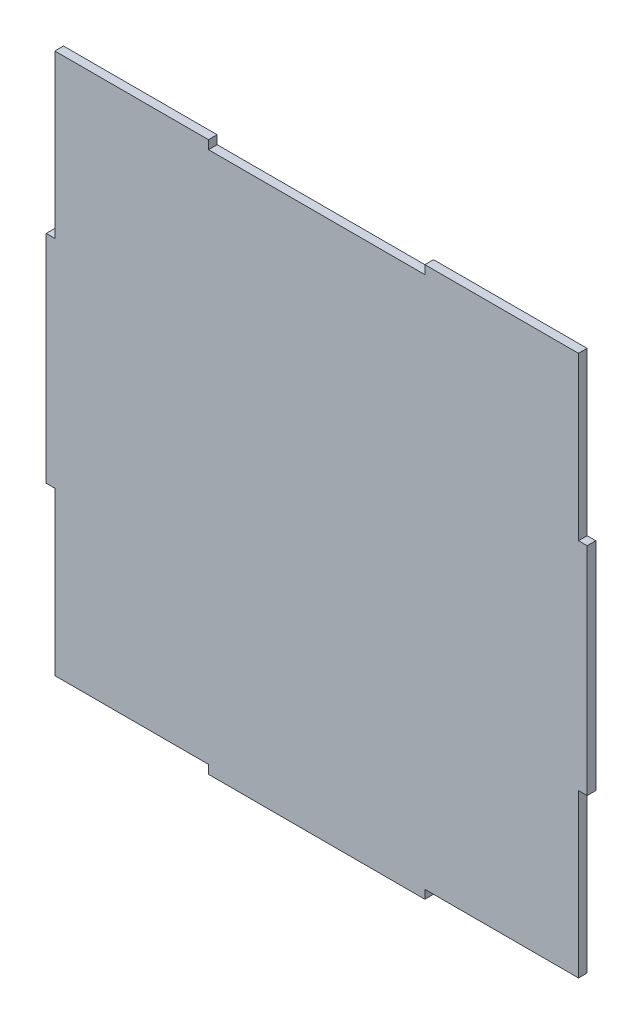
ISO-10303-21;
HEADER;
FILE_DESCRIPTION(('STEP AP214'),'2;1');
FILE_NAME('part.step','',(''),(''),'','','');
FILE_SCHEMA(('AUTOMOTIVE_DESIGN { 1 0 10303 214 1 1 1 1 }'));
ENDSEC;
DATA;
#1=APPLICATION_CONTEXT('core data for automotive mechanical design processes');
#2=APPLICATION_PROTOCOL_DEFINITION('international standard','automotive_design',2000,#1);
#3=PRODUCT_CONTEXT('',#1,'mechanical');
#4=PRODUCT('Part','Part','',(#3));
#5=PRODUCT_RELATED_PRODUCT_CATEGORY('part','',(#4));
#6=PRODUCT_DEFINITION_FORMATION('','',#4);
#7=PRODUCT_DEFINITION_CONTEXT('part definition',#1,'design');
#8=PRODUCT_DEFINITION('design','',#6,#7);
#9=PRODUCT_DEFINITION_SHAPE('','',#8);
#10=(LENGTH_UNIT() NAMED_UNIT(*) SI_UNIT(.MILLI.,.METRE.));
#11=(NAMED_UNIT(*) PLANE_ANGLE_UNIT() SI_UNIT($,.RADIAN.));
#12=(NAMED_UNIT(*) SI_UNIT($,.STERADIAN.) SOLID_ANGLE_UNIT());
#13=UNCERTAINTY_MEASURE_WITH_UNIT(LENGTH_MEASURE(1.E-05),#10,'distance_accuracy_value','');
#14=(GEOMETRIC_REPRESENTATION_CONTEXT(3) GLOBAL_UNCERTAINTY_ASSIGNED_CONTEXT((#13)) GLOBAL_UNIT_ASSIGNED_CONTEXT((#10,
#11,#12)) REPRESENTATION_CONTEXT('',''));
#15=CARTESIAN_POINT('',(0.,0.,0.));
#16=DIRECTION('',(0.,0.,1.));
#17=DIRECTION('',(1.,0.,0.));
#18=AXIS2_PLACEMENT_3D('',#15,#16,#17);
#19=CARTESIAN_POINT('',(-49.6369586243733,1.54619828046665,4.));
#20=DIRECTION('',(0.,1.,0.));
#21=DIRECTION('',(0.,0.,1.));
#22=AXIS2_PLACEMENT_3D('',#19,#20,#21);
#23=PLANE('',#22);
#24=DIRECTION('',(1.,0.,0.));
#25=VECTOR('',#24,1.);
#26=CARTESIAN_POINT('',(-49.6369586243733,1.54619828046665,0.));
#27=LINE('',#26,#25);
#28=CARTESIAN_POINT('',(-120.636958624373,1.54619828046665,0.));
#29=VERTEX_POINT('',#28);
#30=CARTESIAN_POINT('',(-49.6369586243733,1.54619828046665,0.));
#31=VERTEX_POINT('',#30);
#32=EDGE_CURVE('E222',#29,#31,#27,.T.);
#33=ORIENTED_EDGE('',*,*,#32,.T.);
#34=DIRECTION('',(0.,0.,-1.));
#35=VECTOR('',#34,1.);
#36=CARTESIAN_POINT('',(-49.6369586243733,1.54619828046665,4.));
#37=LINE('',#36,#35);
#38=CARTESIAN_POINT('',(-49.6369586243733,1.54619828046665,4.));
#39=VERTEX_POINT('',#38);
#40=EDGE_CURVE('E11',#39,#31,#37,.T.);
#41=ORIENTED_EDGE('',*,*,#40,.F.);
#42=DIRECTION('',(1.,0.,0.));
#43=VECTOR('',#42,1.);
#44=CARTESIAN_POINT('',(-49.6369586243733,1.54619828046665,4.));
#45=LINE('',#44,#43);
#46=CARTESIAN_POINT('',(-120.636958624373,1.54619828046665,4.));
#47=VERTEX_POINT('',#46);
#48=EDGE_CURVE('E280',#47,#39,#45,.T.);
#49=ORIENTED_EDGE('',*,*,#48,.F.);
#50=DIRECTION('',(0.,0.,-1.));
#51=VECTOR('',#50,1.);
#52=CARTESIAN_POINT('',(-120.636958624373,1.54619828046665,4.));
#53=LINE('',#52,#51);
#54=EDGE_CURVE('E218',#47,#29,#53,.T.);
#55=ORIENTED_EDGE('',*,*,#54,.T.);
#56=EDGE_LOOP('',(#33,#41,#49,#55));
#57=FACE_BOUND('',#56,.T.);
#58=ADVANCED_FACE('F49',(#57),#23,.F.);
#59=CARTESIAN_POINT('',(-49.6369586243733,1.54619828046665,4.));
#60=DIRECTION('',(1.,0.,0.));
#61=DIRECTION('',(0.,0.,-1.));
#62=AXIS2_PLACEMENT_3D('',#59,#60,#61);
#63=PLANE('',#62);
#64=DIRECTION('',(0.,-1.,0.));
#65=VECTOR('',#64,1.);
#66=CARTESIAN_POINT('',(-49.6369586243733,1.54619828046665,0.));
#67=LINE('',#66,#65);
#68=CARTESIAN_POINT('',(-49.6369586243733,-2.45380171953336,0.));
#69=VERTEX_POINT('',#68);
#70=EDGE_CURVE('E226',#31,#69,#67,.T.);
#71=ORIENTED_EDGE('',*,*,#70,.T.);
#72=DIRECTION('',(0.,0.,-1.));
#73=VECTOR('',#72,1.);
#74=CARTESIAN_POINT('',(-49.6369586243733,-2.45380171953336,4.));
#75=LINE('',#74,#73);
#76=CARTESIAN_POINT('',(-49.6369586243733,-2.45380171953336,4.));
#77=VERTEX_POINT('',#76);
#78=EDGE_CURVE('E58',#77,#69,#75,.T.);
#79=ORIENTED_EDGE('',*,*,#78,.F.);
#80=DIRECTION('',(0.,-1.,0.));
#81=VECTOR('',#80,1.);
#82=CARTESIAN_POINT('',(-49.6369586243733,1.54619828046665,4.));
#83=LINE('',#82,#81);
#84=EDGE_CURVE('E145',#39,#77,#83,.T.);
#85=ORIENTED_EDGE('',*,*,#84,.F.);
#86=ORIENTED_EDGE('',*,*,#40,.T.);
#87=EDGE_LOOP('',(#71,#79,#85,#86));
#88=FACE_BOUND('',#87,.T.);
#89=ADVANCED_FACE('F430',(#88),#63,.F.);
#90=CARTESIAN_POINT('',(-49.6369586243733,-2.45380171953336,4.));
#91=DIRECTION('',(0.,1.,0.));
#92=DIRECTION('',(0.,0.,1.));
#93=AXIS2_PLACEMENT_3D('',#90,#91,#92);
#94=PLANE('',#93);
#95=DIRECTION('',(1.,0.,0.));
#96=VECTOR('',#95,1.);
#97=CARTESIAN_POINT('',(-49.6369586243733,-2.45380171953336,0.));
#98=LINE('',#97,#96);
#99=CARTESIAN_POINT('',(50.3630413756267,-2.45380171953336,0.));
#100=VERTEX_POINT('',#99);
#101=EDGE_CURVE('E229',#69,#100,#98,.T.);
#102=ORIENTED_EDGE('',*,*,#101,.T.);
#103=DIRECTION('',(0.,0.,-1.));
#104=VECTOR('',#103,1.);
#105=CARTESIAN_POINT('',(50.3630413756267,-2.45380171953336,4.));
#106=LINE('',#105,#104);
#107=CARTESIAN_POINT('',(50.3630413756267,-2.45380171953336,4.));
#108=VERTEX_POINT('',#107);
#109=EDGE_CURVE('E339',#108,#100,#106,.T.);
#110=ORIENTED_EDGE('',*,*,#109,.F.);
#111=DIRECTION('',(1.,0.,0.));
#112=VECTOR('',#111,1.);
#113=CARTESIAN_POINT('',(-49.6369586243733,-2.45380171953336,4.));
#114=LINE('',#113,#112);
#115=EDGE_CURVE('E349',#77,#108,#114,.T.);
#116=ORIENTED_EDGE('',*,*,#115,.F.);
#117=ORIENTED_EDGE('',*,*,#78,.T.);
#118=EDGE_LOOP('',(#102,#110,#116,#117));
#119=FACE_BOUND('',#118,.T.);
#120=ADVANCED_FACE('F347',(#119),#94,.F.);
#121=CARTESIAN_POINT('',(50.3630413756267,-2.45380171953336,4.));
#122=DIRECTION('',(-1.,0.,0.));
#123=DIRECTION('',(0.,0.,1.));
#124=AXIS2_PLACEMENT_3D('',#121,#122,#123);
#125=PLANE('',#124);
#126=DIRECTION('',(0.,1.,0.));
#127=VECTOR('',#126,1.);
#128=CARTESIAN_POINT('',(50.3630413756267,-2.45380171953336,0.));
#129=LINE('',#128,#127);
#130=CARTESIAN_POINT('',(50.3630413756267,1.54619828046665,0.));
#131=VERTEX_POINT('',#130);
#132=EDGE_CURVE('E232',#100,#131,#129,.T.);
#133=ORIENTED_EDGE('',*,*,#132,.T.);
#134=DIRECTION('',(0.,0.,-1.));
#135=VECTOR('',#134,1.);
#136=CARTESIAN_POINT('',(50.3630413756267,1.54619828046665,4.));
#137=LINE('',#136,#135);
#138=CARTESIAN_POINT('',(50.3630413756267,1.54619828046665,4.));
#139=VERTEX_POINT('',#138);
#140=EDGE_CURVE('E335',#139,#131,#137,.T.);
#141=ORIENTED_EDGE('',*,*,#140,.F.);
#142=DIRECTION('',(0.,1.,0.));
#143=VECTOR('',#142,1.);
#144=CARTESIAN_POINT('',(50.3630413756267,-2.45380171953336,4.));
#145=LINE('',#144,#143);
#146=EDGE_CURVE('E368',#108,#139,#145,.T.);
#147=ORIENTED_EDGE('',*,*,#146,.F.);
#148=ORIENTED_EDGE('',*,*,#109,.T.);
#149=EDGE_LOOP('',(#133,#141,#147,#148));
#150=FACE_BOUND('',#149,.T.);
#151=ADVANCED_FACE('F358',(#150),#125,.F.);
#152=CARTESIAN_POINT('',(121.363041375627,1.54619828046665,4.));
#153=DIRECTION('',(0.,1.,0.));
#154=DIRECTION('',(0.,0.,1.));
#155=AXIS2_PLACEMENT_3D('',#152,#153,#154);
#156=PLANE('',#155);
#157=DIRECTION('',(1.,0.,0.));
#158=VECTOR('',#157,1.);
#159=CARTESIAN_POINT('',(121.363041375627,1.54619828046665,0.));
#160=LINE('',#159,#158);
#161=CARTESIAN_POINT('',(121.363041375627,1.54619828046665,0.));
#162=VERTEX_POINT('',#161);
#163=EDGE_CURVE('E235',#131,#162,#160,.T.);
#164=ORIENTED_EDGE('',*,*,#163,.T.);
#165=DIRECTION('',(0.,0.,-1.));
#166=VECTOR('',#165,1.);
#167=CARTESIAN_POINT('',(121.363041375627,1.54619828046665,4.));
#168=LINE('',#167,#166);
#169=CARTESIAN_POINT('',(121.363041375627,1.54619828046665,4.));
#170=VERTEX_POINT('',#169);
#171=EDGE_CURVE('E331',#170,#162,#168,.T.);
#172=ORIENTED_EDGE('',*,*,#171,.F.);
#173=DIRECTION('',(1.,0.,0.));
#174=VECTOR('',#173,1.);
#175=CARTESIAN_POINT('',(121.363041375627,1.54619828046665,4.));
#176=LINE('',#175,#174);
#177=EDGE_CURVE('E364',#139,#170,#176,.T.);
#178=ORIENTED_EDGE('',*,*,#177,.F.);
#179=ORIENTED_EDGE('',*,*,#140,.T.);
#180=EDGE_LOOP('',(#164,#172,#178,#179));
#181=FACE_BOUND('',#180,.T.);
#182=ADVANCED_FACE('F362',(#181),#156,.F.);
#183=CARTESIAN_POINT('',(121.363041375627,76.5461982804666,4.));
#184=DIRECTION('',(-1.,0.,0.));
#185=DIRECTION('',(0.,0.,1.));
#186=AXIS2_PLACEMENT_3D('',#183,#184,#185);
#187=PLANE('',#186);
#188=DIRECTION('',(0.,1.,0.));
#189=VECTOR('',#188,1.);
#190=CARTESIAN_POINT('',(121.363041375627,76.5461982804666,0.));
#191=LINE('',#190,#189);
#192=CARTESIAN_POINT('',(121.363041375627,76.5461982804666,0.));
#193=VERTEX_POINT('',#192);
#194=EDGE_CURVE('E238',#162,#193,#191,.T.);
#195=ORIENTED_EDGE('',*,*,#194,.T.);
#196=DIRECTION('',(0.,0.,-1.));
#197=VECTOR('',#196,1.);
#198=CARTESIAN_POINT('',(121.363041375627,76.5461982804666,4.));
#199=LINE('',#198,#197);
#200=CARTESIAN_POINT('',(121.363041375627,76.5461982804666,4.));
#201=VERTEX_POINT('',#200);
#202=EDGE_CURVE('E327',#201,#193,#199,.T.);
#203=ORIENTED_EDGE('',*,*,#202,.F.);
#204=DIRECTION('',(0.,1.,0.));
#205=VECTOR('',#204,1.);
#206=CARTESIAN_POINT('',(121.363041375627,76.5461982804666,4.));
#207=LINE('',#206,#205);
#208=EDGE_CURVE('E367',#170,#201,#207,.T.);
#209=ORIENTED_EDGE('',*,*,#208,.F.);
#210=ORIENTED_EDGE('',*,*,#171,.T.);
#211=EDGE_LOOP('',(#195,#203,#209,#210));
#212=FACE_BOUND('',#211,.T.);
#213=ADVANCED_FACE('F443',(#212),#187,.F.);
#214=CARTESIAN_POINT('',(125.363041375627,76.5461982804666,4.));
#215=DIRECTION('',(0.,1.,0.));
#216=DIRECTION('',(0.,0.,1.));
#217=AXIS2_PLACEMENT_3D('',#214,#215,#216);
#218=PLANE('',#217);
#219=DIRECTION('',(1.,0.,0.));
#220=VECTOR('',#219,1.);
#221=CARTESIAN_POINT('',(125.363041375627,76.5461982804666,0.));
#222=LINE('',#221,#220);
#223=CARTESIAN_POINT('',(125.363041375627,76.5461982804666,0.));
#224=VERTEX_POINT('',#223);
#225=EDGE_CURVE('E241',#193,#224,#222,.T.);
#226=ORIENTED_EDGE('',*,*,#225,.T.);
#227=DIRECTION('',(0.,0.,-1.));
#228=VECTOR('',#227,1.);
#229=CARTESIAN_POINT('',(125.363041375627,76.5461982804666,4.));
#230=LINE('',#229,#228);
#231=CARTESIAN_POINT('',(125.363041375627,76.5461982804666,4.));
#232=VERTEX_POINT('',#231);
#233=EDGE_CURVE('E323',#232,#224,#230,.T.);
#234=ORIENTED_EDGE('',*,*,#233,.F.);
#235=DIRECTION('',(1.,0.,0.));
#236=VECTOR('',#235,1.);
#237=CARTESIAN_POINT('',(125.363041375627,76.5461982804666,4.));
#238=LINE('',#237,#236);
#239=EDGE_CURVE('E372',#201,#232,#238,.T.);
#240=ORIENTED_EDGE('',*,*,#239,.F.);
#241=ORIENTED_EDGE('',*,*,#202,.T.);
#242=EDGE_LOOP('',(#226,#234,#240,#241));
#243=FACE_BOUND('',#242,.T.);
#244=ADVANCED_FACE('F446',(#243),#218,.F.);
#245=CARTESIAN_POINT('',(125.363041375627,176.546198280467,4.));
#246=DIRECTION('',(-1.,0.,0.));
#247=DIRECTION('',(0.,0.,1.));
#248=AXIS2_PLACEMENT_3D('',#245,#246,#247);
#249=PLANE('',#248);
#250=DIRECTION('',(0.,1.,0.));
#251=VECTOR('',#250,1.);
#252=CARTESIAN_POINT('',(125.363041375627,176.546198280467,0.));
#253=LINE('',#252,#251);
#254=CARTESIAN_POINT('',(125.363041375627,176.546198280467,0.));
#255=VERTEX_POINT('',#254);
#256=EDGE_CURVE('E244',#224,#255,#253,.T.);
#257=ORIENTED_EDGE('',*,*,#256,.T.);
#258=DIRECTION('',(0.,0.,-1.));
#259=VECTOR('',#258,1.);
#260=CARTESIAN_POINT('',(125.363041375627,176.546198280467,4.));
#261=LINE('',#260,#259);
#262=CARTESIAN_POINT('',(125.363041375627,176.546198280467,4.));
#263=VERTEX_POINT('',#262);
#264=EDGE_CURVE('E319',#263,#255,#261,.T.);
#265=ORIENTED_EDGE('',*,*,#264,.F.);
#266=DIRECTION('',(0.,1.,0.));
#267=VECTOR('',#266,1.);
#268=CARTESIAN_POINT('',(125.363041375627,176.546198280467,4.));
#269=LINE('',#268,#267);
#270=EDGE_CURVE('E379',#232,#263,#269,.T.);
#271=ORIENTED_EDGE('',*,*,#270,.F.);
#272=ORIENTED_EDGE('',*,*,#233,.T.);
#273=EDGE_LOOP('',(#257,#265,#271,#272));
#274=FACE_BOUND('',#273,.T.);
#275=ADVANCED_FACE('F450',(#274),#249,.F.);
#276=CARTESIAN_POINT('',(121.363041375627,176.546198280467,4.));
#277=DIRECTION('',(0.,-1.,0.));
#278=DIRECTION('',(0.,0.,-1.));
#279=AXIS2_PLACEMENT_3D('',#276,#277,#278);
#280=PLANE('',#279);
#281=DIRECTION('',(-1.,0.,0.));
#282=VECTOR('',#281,1.);
#283=CARTESIAN_POINT('',(121.363041375627,176.546198280467,0.));
#284=LINE('',#283,#282);
#285=CARTESIAN_POINT('',(121.363041375627,176.546198280467,0.));
#286=VERTEX_POINT('',#285);
#287=EDGE_CURVE('E247',#255,#286,#284,.T.);
#288=ORIENTED_EDGE('',*,*,#287,.T.);
#289=DIRECTION('',(0.,0.,-1.));
#290=VECTOR('',#289,1.);
#291=CARTESIAN_POINT('',(121.363041375627,176.546198280467,4.));
#292=LINE('',#291,#290);
#293=CARTESIAN_POINT('',(121.363041375627,176.546198280467,4.));
#294=VERTEX_POINT('',#293);
#295=EDGE_CURVE('E315',#294,#286,#292,.T.);
#296=ORIENTED_EDGE('',*,*,#295,.F.);
#297=DIRECTION('',(-1.,0.,0.));
#298=VECTOR('',#297,1.);
#299=CARTESIAN_POINT('',(121.363041375627,176.546198280467,4.));
#300=LINE('',#299,#298);
#301=EDGE_CURVE('E382',#263,#294,#300,.T.);
#302=ORIENTED_EDGE('',*,*,#301,.F.);
#303=ORIENTED_EDGE('',*,*,#264,.T.);
#304=EDGE_LOOP('',(#288,#296,#302,#303));
#305=FACE_BOUND('',#304,.T.);
#306=ADVANCED_FACE('F454',(#305),#280,.F.);
#307=CARTESIAN_POINT('',(121.363041375627,251.546198280467,4.));
#308=DIRECTION('',(-1.,0.,0.));
#309=DIRECTION('',(0.,0.,1.));
#310=AXIS2_PLACEMENT_3D('',#307,#308,#309);
#311=PLANE('',#310);
#312=DIRECTION('',(0.,1.,0.));
#313=VECTOR('',#312,1.);
#314=CARTESIAN_POINT('',(121.363041375627,251.546198280467,0.));
#315=LINE('',#314,#313);
#316=CARTESIAN_POINT('',(121.363041375627,251.546198280467,0.));
#317=VERTEX_POINT('',#316);
#318=EDGE_CURVE('E250',#286,#317,#315,.T.);
#319=ORIENTED_EDGE('',*,*,#318,.T.);
#320=DIRECTION('',(0.,0.,-1.));
#321=VECTOR('',#320,1.);
#322=CARTESIAN_POINT('',(121.363041375627,251.546198280467,4.));
#323=LINE('',#322,#321);
#324=CARTESIAN_POINT('',(121.363041375627,251.546198280467,4.));
#325=VERTEX_POINT('',#324);
#326=EDGE_CURVE('E311',#325,#317,#323,.T.);
#327=ORIENTED_EDGE('',*,*,#326,.F.);
#328=DIRECTION('',(0.,1.,0.));
#329=VECTOR('',#328,1.);
#330=CARTESIAN_POINT('',(121.363041375627,251.546198280467,4.));
#331=LINE('',#330,#329);
#332=EDGE_CURVE('E385',#294,#325,#331,.T.);
#333=ORIENTED_EDGE('',*,*,#332,.F.);
#334=ORIENTED_EDGE('',*,*,#295,.T.);
#335=EDGE_LOOP('',(#319,#327,#333,#334));
#336=FACE_BOUND('',#335,.T.);
#337=ADVANCED_FACE('F458',(#336),#311,.F.);
#338=CARTESIAN_POINT('',(50.3630413756267,251.546198280467,4.));
#339=DIRECTION('',(0.,-1.,0.));
#340=DIRECTION('',(0.,0.,-1.));
#341=AXIS2_PLACEMENT_3D('',#338,#339,#340);
#342=PLANE('',#341);
#343=DIRECTION('',(-1.,0.,0.));
#344=VECTOR('',#343,1.);
#345=CARTESIAN_POINT('',(50.3630413756267,251.546198280467,0.));
#346=LINE('',#345,#344);
#347=CARTESIAN_POINT('',(50.3630413756267,251.546198280467,0.));
#348=VERTEX_POINT('',#347);
#349=EDGE_CURVE('E253',#317,#348,#346,.T.);
#350=ORIENTED_EDGE('',*,*,#349,.T.);
#351=DIRECTION('',(0.,0.,-1.));
#352=VECTOR('',#351,1.);
#353=CARTESIAN_POINT('',(50.3630413756267,251.546198280467,4.));
#354=LINE('',#353,#352);
#355=CARTESIAN_POINT('',(50.3630413756267,251.546198280467,4.));
#356=VERTEX_POINT('',#355);
#357=EDGE_CURVE('E307',#356,#348,#354,.T.);
#358=ORIENTED_EDGE('',*,*,#357,.F.);
#359=DIRECTION('',(-1.,0.,0.));
#360=VECTOR('',#359,1.);
#361=CARTESIAN_POINT('',(50.3630413756267,251.546198280467,4.));
#362=LINE('',#361,#360);
#363=EDGE_CURVE('E388',#325,#356,#362,.T.);
#364=ORIENTED_EDGE('',*,*,#363,.F.);
#365=ORIENTED_EDGE('',*,*,#326,.T.);
#366=EDGE_LOOP('',(#350,#358,#364,#365));
#367=FACE_BOUND('',#366,.T.);
#368=ADVANCED_FACE('F462',(#367),#342,.F.);
#369=CARTESIAN_POINT('',(50.3630413756267,247.546198280467,4.));
#370=DIRECTION('',(1.,0.,0.));
#371=DIRECTION('',(0.,0.,-1.));
#372=AXIS2_PLACEMENT_3D('',#369,#370,#371);
#373=PLANE('',#372);
#374=DIRECTION('',(0.,-1.,0.));
#375=VECTOR('',#374,1.);
#376=CARTESIAN_POINT('',(50.3630413756267,247.546198280467,0.));
#377=LINE('',#376,#375);
#378=CARTESIAN_POINT('',(50.3630413756267,247.546198280467,0.));
#379=VERTEX_POINT('',#378);
#380=EDGE_CURVE('E256',#348,#379,#377,.T.);
#381=ORIENTED_EDGE('',*,*,#380,.T.);
#382=DIRECTION('',(0.,0.,-1.));
#383=VECTOR('',#382,1.);
#384=CARTESIAN_POINT('',(50.3630413756267,247.546198280467,4.));
#385=LINE('',#384,#383);
#386=CARTESIAN_POINT('',(50.3630413756267,247.546198280467,4.));
#387=VERTEX_POINT('',#386);
#388=EDGE_CURVE('E303',#387,#379,#385,.T.);
#389=ORIENTED_EDGE('',*,*,#388,.F.);
#390=DIRECTION('',(0.,-1.,0.));
#391=VECTOR('',#390,1.);
#392=CARTESIAN_POINT('',(50.3630413756267,247.546198280467,4.));
#393=LINE('',#392,#391);
#394=EDGE_CURVE('E391',#356,#387,#393,.T.);
#395=ORIENTED_EDGE('',*,*,#394,.F.);
#396=ORIENTED_EDGE('',*,*,#357,.T.);
#397=EDGE_LOOP('',(#381,#389,#395,#396));
#398=FACE_BOUND('',#397,.T.);
#399=ADVANCED_FACE('F466',(#398),#373,.F.);
#400=CARTESIAN_POINT('',(-49.6369586243733,247.546198280467,4.));
#401=DIRECTION('',(0.,-1.,0.));
#402=DIRECTION('',(0.,0.,-1.));
#403=AXIS2_PLACEMENT_3D('',#400,#401,#402);
#404=PLANE('',#403);
#405=DIRECTION('',(-1.,0.,0.));
#406=VECTOR('',#405,1.);
#407=CARTESIAN_POINT('',(-49.6369586243733,247.546198280467,0.));
#408=LINE('',#407,#406);
#409=CARTESIAN_POINT('',(-49.6369586243733,247.546198280467,0.));
#410=VERTEX_POINT('',#409);
#411=EDGE_CURVE('E259',#379,#410,#408,.T.);
#412=ORIENTED_EDGE('',*,*,#411,.T.);
#413=DIRECTION('',(0.,0.,-1.));
#414=VECTOR('',#413,1.);
#415=CARTESIAN_POINT('',(-49.6369586243733,247.546198280467,4.));
#416=LINE('',#415,#414);
#417=CARTESIAN_POINT('',(-49.6369586243733,247.546198280467,4.));
#418=VERTEX_POINT('',#417);
#419=EDGE_CURVE('E299',#418,#410,#416,.T.);
#420=ORIENTED_EDGE('',*,*,#419,.F.);
#421=DIRECTION('',(-1.,0.,0.));
#422=VECTOR('',#421,1.);
#423=CARTESIAN_POINT('',(-49.6369586243733,247.546198280467,4.));
#424=LINE('',#423,#422);
#425=EDGE_CURVE('E394',#387,#418,#424,.T.);
#426=ORIENTED_EDGE('',*,*,#425,.F.);
#427=ORIENTED_EDGE('',*,*,#388,.T.);
#428=EDGE_LOOP('',(#412,#420,#426,#427));
#429=FACE_BOUND('',#428,.T.);
#430=ADVANCED_FACE('F470',(#429),#404,.F.);
#431=CARTESIAN_POINT('',(-49.6369586243733,251.546198280467,4.));
#432=DIRECTION('',(-1.,0.,0.));
#433=DIRECTION('',(0.,0.,1.));
#434=AXIS2_PLACEMENT_3D('',#431,#432,#433);
#435=PLANE('',#434);
#436=DIRECTION('',(0.,1.,0.));
#437=VECTOR('',#436,1.);
#438=CARTESIAN_POINT('',(-49.6369586243733,251.546198280467,0.));
#439=LINE('',#438,#437);
#440=CARTESIAN_POINT('',(-49.6369586243733,251.546198280467,0.));
#441=VERTEX_POINT('',#440);
#442=EDGE_CURVE('E262',#410,#441,#439,.T.);
#443=ORIENTED_EDGE('',*,*,#442,.T.);
#444=DIRECTION('',(0.,0.,-1.));
#445=VECTOR('',#444,1.);
#446=CARTESIAN_POINT('',(-49.6369586243733,251.546198280467,4.));
#447=LINE('',#446,#445);
#448=CARTESIAN_POINT('',(-49.6369586243733,251.546198280467,4.));
#449=VERTEX_POINT('',#448);
#450=EDGE_CURVE('E295',#449,#441,#447,.T.);
#451=ORIENTED_EDGE('',*,*,#450,.F.);
#452=DIRECTION('',(0.,1.,0.));
#453=VECTOR('',#452,1.);
#454=CARTESIAN_POINT('',(-49.6369586243733,251.546198280467,4.));
#455=LINE('',#454,#453);
#456=EDGE_CURVE('E397',#418,#449,#455,.T.);
#457=ORIENTED_EDGE('',*,*,#456,.F.);
#458=ORIENTED_EDGE('',*,*,#419,.T.);
#459=EDGE_LOOP('',(#443,#451,#457,#458));
#460=FACE_BOUND('',#459,.T.);
#461=ADVANCED_FACE('F474',(#460),#435,.F.);
#462=CARTESIAN_POINT('',(-120.636958624373,251.546198280467,4.));
#463=DIRECTION('',(0.,-1.,0.));
#464=DIRECTION('',(0.,0.,-1.));
#465=AXIS2_PLACEMENT_3D('',#462,#463,#464);
#466=PLANE('',#465);
#467=DIRECTION('',(-1.,0.,0.));
#468=VECTOR('',#467,1.);
#469=CARTESIAN_POINT('',(-120.636958624373,251.546198280467,0.));
#470=LINE('',#469,#468);
#471=CARTESIAN_POINT('',(-120.636958624373,251.546198280467,0.));
#472=VERTEX_POINT('',#471);
#473=EDGE_CURVE('E265',#441,#472,#470,.T.);
#474=ORIENTED_EDGE('',*,*,#473,.T.);
#475=DIRECTION('',(0.,0.,-1.));
#476=VECTOR('',#475,1.);
#477=CARTESIAN_POINT('',(-120.636958624373,251.546198280467,4.));
#478=LINE('',#477,#476);
#479=CARTESIAN_POINT('',(-120.636958624373,251.546198280467,4.));
#480=VERTEX_POINT('',#479);
#481=EDGE_CURVE('E291',#480,#472,#478,.T.);
#482=ORIENTED_EDGE('',*,*,#481,.F.);
#483=DIRECTION('',(-1.,0.,0.));
#484=VECTOR('',#483,1.);
#485=CARTESIAN_POINT('',(-120.636958624373,251.546198280467,4.));
#486=LINE('',#485,#484);
#487=EDGE_CURVE('E400',#449,#480,#486,.T.);
#488=ORIENTED_EDGE('',*,*,#487,.F.);
#489=ORIENTED_EDGE('',*,*,#450,.T.);
#490=EDGE_LOOP('',(#474,#482,#488,#489));
#491=FACE_BOUND('',#490,.T.);
#492=ADVANCED_FACE('F478',(#491),#466,.F.);
#493=CARTESIAN_POINT('',(-120.636958624373,176.546198280467,4.));
#494=DIRECTION('',(1.,0.,0.));
#495=DIRECTION('',(0.,0.,-1.));
#496=AXIS2_PLACEMENT_3D('',#493,#494,#495);
#497=PLANE('',#496);
#498=DIRECTION('',(0.,-1.,0.));
#499=VECTOR('',#498,1.);
#500=CARTESIAN_POINT('',(-120.636958624373,176.546198280467,0.));
#501=LINE('',#500,#499);
#502=CARTESIAN_POINT('',(-120.636958624373,176.546198280467,0.));
#503=VERTEX_POINT('',#502);
#504=EDGE_CURVE('E268',#472,#503,#501,.T.);
#505=ORIENTED_EDGE('',*,*,#504,.T.);
#506=DIRECTION('',(0.,0.,-1.));
#507=VECTOR('',#506,1.);
#508=CARTESIAN_POINT('',(-120.636958624373,176.546198280467,4.));
#509=LINE('',#508,#507);
#510=CARTESIAN_POINT('',(-120.636958624373,176.546198280467,4.));
#511=VERTEX_POINT('',#510);
#512=EDGE_CURVE('E287',#511,#503,#509,.T.);
#513=ORIENTED_EDGE('',*,*,#512,.F.);
#514=DIRECTION('',(0.,-1.,0.));
#515=VECTOR('',#514,1.);
#516=CARTESIAN_POINT('',(-120.636958624373,176.546198280467,4.));
#517=LINE('',#516,#515);
#518=EDGE_CURVE('E403',#480,#511,#517,.T.);
#519=ORIENTED_EDGE('',*,*,#518,.F.);
#520=ORIENTED_EDGE('',*,*,#481,.T.);
#521=EDGE_LOOP('',(#505,#513,#519,#520));
#522=FACE_BOUND('',#521,.T.);
#523=ADVANCED_FACE('F411',(#522),#497,.F.);
#524=CARTESIAN_POINT('',(-124.636958624373,176.546198280467,4.));
#525=DIRECTION('',(0.,-1.,0.));
#526=DIRECTION('',(0.,0.,-1.));
#527=AXIS2_PLACEMENT_3D('',#524,#525,#526);
#528=PLANE('',#527);
#529=DIRECTION('',(-1.,0.,0.));
#530=VECTOR('',#529,1.);
#531=CARTESIAN_POINT('',(-124.636958624373,176.546198280467,0.));
#532=LINE('',#531,#530);
#533=CARTESIAN_POINT('',(-124.636958624373,176.546198280467,0.));
#534=VERTEX_POINT('',#533);
#535=EDGE_CURVE('E271',#503,#534,#532,.T.);
#536=ORIENTED_EDGE('',*,*,#535,.T.);
#537=DIRECTION('',(0.,0.,-1.));
#538=VECTOR('',#537,1.);
#539=CARTESIAN_POINT('',(-124.636958624373,176.546198280467,4.));
#540=LINE('',#539,#538);
#541=CARTESIAN_POINT('',(-124.636958624373,176.546198280467,4.));
#542=VERTEX_POINT('',#541);
#543=EDGE_CURVE('E211',#542,#534,#540,.T.);
#544=ORIENTED_EDGE('',*,*,#543,.F.);
#545=DIRECTION('',(-1.,0.,0.));
#546=VECTOR('',#545,1.);
#547=CARTESIAN_POINT('',(-124.636958624373,176.546198280467,4.));
#548=LINE('',#547,#546);
#549=EDGE_CURVE('E200',#511,#542,#548,.T.);
#550=ORIENTED_EDGE('',*,*,#549,.F.);
#551=ORIENTED_EDGE('',*,*,#512,.T.);
#552=EDGE_LOOP('',(#536,#544,#550,#551));
#553=FACE_BOUND('',#552,.T.);
#554=ADVANCED_FACE('F415',(#553),#528,.F.);
#555=CARTESIAN_POINT('',(-124.636958624373,76.5461982804666,4.));
#556=DIRECTION('',(1.,0.,0.));
#557=DIRECTION('',(0.,0.,-1.));
#558=AXIS2_PLACEMENT_3D('',#555,#556,#557);
#559=PLANE('',#558);
#560=DIRECTION('',(0.,-1.,0.));
#561=VECTOR('',#560,1.);
#562=CARTESIAN_POINT('',(-124.636958624373,76.5461982804666,0.));
#563=LINE('',#562,#561);
#564=CARTESIAN_POINT('',(-124.636958624373,76.5461982804666,0.));
#565=VERTEX_POINT('',#564);
#566=EDGE_CURVE('E209',#534,#565,#563,.T.);
#567=ORIENTED_EDGE('',*,*,#566,.T.);
#568=DIRECTION('',(0.,0.,-1.));
#569=VECTOR('',#568,1.);
#570=CARTESIAN_POINT('',(-124.636958624373,76.5461982804666,4.));
#571=LINE('',#570,#569);
#572=CARTESIAN_POINT('',(-124.636958624373,76.5461982804666,4.));
#573=VERTEX_POINT('',#572);
#574=EDGE_CURVE('E206',#573,#565,#571,.T.);
#575=ORIENTED_EDGE('',*,*,#574,.F.);
#576=DIRECTION('',(0.,-1.,0.));
#577=VECTOR('',#576,1.);
#578=CARTESIAN_POINT('',(-124.636958624373,76.5461982804666,4.));
#579=LINE('',#578,#577);
#580=EDGE_CURVE('E194',#542,#573,#579,.T.);
#581=ORIENTED_EDGE('',*,*,#580,.F.);
#582=ORIENTED_EDGE('',*,*,#543,.T.);
#583=EDGE_LOOP('',(#567,#575,#581,#582));
#584=FACE_BOUND('',#583,.T.);
#585=ADVANCED_FACE('F207',(#584),#559,.F.);
#586=CARTESIAN_POINT('',(-120.636958624373,76.5461982804666,4.));
#587=DIRECTION('',(0.,1.,0.));
#588=DIRECTION('',(0.,0.,1.));
#589=AXIS2_PLACEMENT_3D('',#586,#587,#588);
#590=PLANE('',#589);
#591=DIRECTION('',(1.,0.,0.));
#592=VECTOR('',#591,1.);
#593=CARTESIAN_POINT('',(-120.636958624373,76.5461982804666,0.));
#594=LINE('',#593,#592);
#595=CARTESIAN_POINT('',(-120.636958624373,76.5461982804666,0.));
#596=VERTEX_POINT('',#595);
#597=EDGE_CURVE('E131',#565,#596,#594,.T.);
#598=ORIENTED_EDGE('',*,*,#597,.T.);
#599=DIRECTION('',(0.,0.,-1.));
#600=VECTOR('',#599,1.);
#601=CARTESIAN_POINT('',(-120.636958624373,76.5461982804666,4.));
#602=LINE('',#601,#600);
#603=CARTESIAN_POINT('',(-120.636958624373,76.5461982804666,4.));
#604=VERTEX_POINT('',#603);
#605=EDGE_CURVE('E212',#604,#596,#602,.T.);
#606=ORIENTED_EDGE('',*,*,#605,.F.);
#607=DIRECTION('',(1.,0.,0.));
#608=VECTOR('',#607,1.);
#609=CARTESIAN_POINT('',(-120.636958624373,76.5461982804666,4.));
#610=LINE('',#609,#608);
#611=EDGE_CURVE('E198',#573,#604,#610,.T.);
#612=ORIENTED_EDGE('',*,*,#611,.F.);
#613=ORIENTED_EDGE('',*,*,#574,.T.);
#614=EDGE_LOOP('',(#598,#606,#612,#613));
#615=FACE_BOUND('',#614,.T.);
#616=ADVANCED_FACE('F214',(#615),#590,.F.);
#617=CARTESIAN_POINT('',(-120.636958624373,1.54619828046665,4.));
#618=DIRECTION('',(1.,0.,0.));
#619=DIRECTION('',(0.,0.,-1.));
#620=AXIS2_PLACEMENT_3D('',#617,#618,#619);
#621=PLANE('',#620);
#622=DIRECTION('',(0.,-1.,0.));
#623=VECTOR('',#622,1.);
#624=CARTESIAN_POINT('',(-120.636958624373,1.54619828046665,0.));
#625=LINE('',#624,#623);
#626=EDGE_CURVE('E137',#596,#29,#625,.T.);
#627=ORIENTED_EDGE('',*,*,#626,.T.);
#628=ORIENTED_EDGE('',*,*,#54,.F.);
#629=DIRECTION('',(0.,-1.,0.));
#630=VECTOR('',#629,1.);
#631=CARTESIAN_POINT('',(-120.636958624373,1.54619828046665,4.));
#632=LINE('',#631,#630);
#633=EDGE_CURVE('E66',#604,#47,#632,.T.);
#634=ORIENTED_EDGE('',*,*,#633,.F.);
#635=ORIENTED_EDGE('',*,*,#605,.T.);
#636=EDGE_LOOP('',(#627,#628,#634,#635));
#637=FACE_BOUND('',#636,.T.);
#638=ADVANCED_FACE('F419',(#637),#621,.F.);
#639=CARTESIAN_POINT('',(0.,0.,4.));
#640=DIRECTION('',(0.,0.,-1.));
#641=DIRECTION('',(-1.,0.,0.));
#642=AXIS2_PLACEMENT_3D('',#639,#640,#641);
#643=PLANE('',#642);
#644=ORIENTED_EDGE('',*,*,#48,.T.);
#645=ORIENTED_EDGE('',*,*,#84,.T.);
#646=ORIENTED_EDGE('',*,*,#115,.T.);
#647=ORIENTED_EDGE('',*,*,#146,.T.);
#648=ORIENTED_EDGE('',*,*,#177,.T.);
#649=ORIENTED_EDGE('',*,*,#208,.T.);
#650=ORIENTED_EDGE('',*,*,#239,.T.);
#651=ORIENTED_EDGE('',*,*,#270,.T.);
#652=ORIENTED_EDGE('',*,*,#301,.T.);
#653=ORIENTED_EDGE('',*,*,#332,.T.);
#654=ORIENTED_EDGE('',*,*,#363,.T.);
#655=ORIENTED_EDGE('',*,*,#394,.T.);
#656=ORIENTED_EDGE('',*,*,#425,.T.);
#657=ORIENTED_EDGE('',*,*,#456,.T.);
#658=ORIENTED_EDGE('',*,*,#487,.T.);
#659=ORIENTED_EDGE('',*,*,#518,.T.);
#660=ORIENTED_EDGE('',*,*,#549,.T.);
#661=ORIENTED_EDGE('',*,*,#580,.T.);
#662=ORIENTED_EDGE('',*,*,#611,.T.);
#663=ORIENTED_EDGE('',*,*,#633,.T.);
#664=EDGE_LOOP('',(#644,#645,#646,#647,#648,#649,#650,#651,#652,#653,#654,#655,#656,#657,#658,
#659,#660,#661,#662,#663));
#665=FACE_BOUND('',#664,.T.);
#666=ADVANCED_FACE('F196',(#665),#643,.F.);
#667=CARTESIAN_POINT('',(0.,0.,0.));
#668=DIRECTION('',(0.,0.,-1.));
#669=DIRECTION('',(-1.,0.,0.));
#670=AXIS2_PLACEMENT_3D('',#667,#668,#669);
#671=PLANE('',#670);
#672=ORIENTED_EDGE('',*,*,#32,.F.);
#673=ORIENTED_EDGE('',*,*,#626,.F.);
#674=ORIENTED_EDGE('',*,*,#597,.F.);
#675=ORIENTED_EDGE('',*,*,#566,.F.);
#676=ORIENTED_EDGE('',*,*,#535,.F.);
#677=ORIENTED_EDGE('',*,*,#504,.F.);
#678=ORIENTED_EDGE('',*,*,#473,.F.);
#679=ORIENTED_EDGE('',*,*,#442,.F.);
#680=ORIENTED_EDGE('',*,*,#411,.F.);
#681=ORIENTED_EDGE('',*,*,#380,.F.);
#682=ORIENTED_EDGE('',*,*,#349,.F.);
#683=ORIENTED_EDGE('',*,*,#318,.F.);
#684=ORIENTED_EDGE('',*,*,#287,.F.);
#685=ORIENTED_EDGE('',*,*,#256,.F.);
#686=ORIENTED_EDGE('',*,*,#225,.F.);
#687=ORIENTED_EDGE('',*,*,#194,.F.);
#688=ORIENTED_EDGE('',*,*,#163,.F.);
#689=ORIENTED_EDGE('',*,*,#132,.F.);
#690=ORIENTED_EDGE('',*,*,#101,.F.);
#691=ORIENTED_EDGE('',*,*,#70,.F.);
#692=EDGE_LOOP('',(#672,#673,#674,#675,#676,#677,#678,#679,#680,#681,#682,#683,#684,#685,#686,
#687,#688,#689,#690,#691));
#693=FACE_BOUND('',#692,.T.);
#694=ADVANCED_FACE('F353',(#693),#671,.T.);
#695=CLOSED_SHELL('',(#58,#89,#120,#151,#182,#213,#244,#275,#306,#337,#368,#399,#430,#461,#492,
#523,#554,#585,#616,#638,#666,#694));
#696=MANIFOLD_SOLID_BREP('B2',#695);
#697=ADVANCED_BREP_SHAPE_REPRESENTATION('',(#18,#696),#14);
#698=SHAPE_DEFINITION_REPRESENTATION(#9,#697);
ENDSEC;
END-ISO-10303-21;
